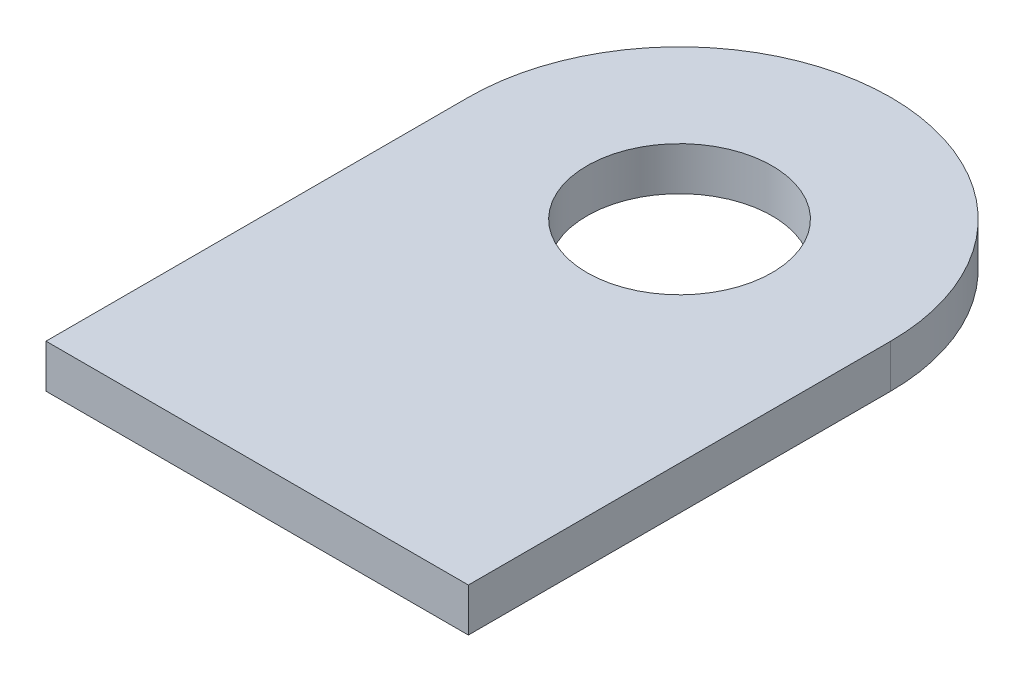
ISO-10303-21;
HEADER;
FILE_DESCRIPTION(('STEP AP214'),'2;1');
FILE_NAME('part.step','',(''),(''),'','','');
FILE_SCHEMA(('AUTOMOTIVE_DESIGN { 1 0 10303 214 1 1 1 1 }'));
ENDSEC;
DATA;
#1=APPLICATION_CONTEXT('core data for automotive mechanical design processes');
#2=APPLICATION_PROTOCOL_DEFINITION('international standard','automotive_design',2000,#1);
#3=PRODUCT_CONTEXT('',#1,'mechanical');
#4=PRODUCT('Part','Part','',(#3));
#5=PRODUCT_RELATED_PRODUCT_CATEGORY('part','',(#4));
#6=PRODUCT_DEFINITION_FORMATION('','',#4);
#7=PRODUCT_DEFINITION_CONTEXT('part definition',#1,'design');
#8=PRODUCT_DEFINITION('design','',#6,#7);
#9=PRODUCT_DEFINITION_SHAPE('','',#8);
#10=(LENGTH_UNIT() NAMED_UNIT(*) SI_UNIT(.MILLI.,.METRE.));
#11=(NAMED_UNIT(*) PLANE_ANGLE_UNIT() SI_UNIT($,.RADIAN.));
#12=(NAMED_UNIT(*) SI_UNIT($,.STERADIAN.) SOLID_ANGLE_UNIT());
#13=UNCERTAINTY_MEASURE_WITH_UNIT(LENGTH_MEASURE(1.E-05),#10,'distance_accuracy_value','');
#14=(GEOMETRIC_REPRESENTATION_CONTEXT(3) GLOBAL_UNCERTAINTY_ASSIGNED_CONTEXT((#13)) GLOBAL_UNIT_ASSIGNED_CONTEXT((#10,
#11,#12)) REPRESENTATION_CONTEXT('',''));
#15=CARTESIAN_POINT('',(0.,0.,0.));
#16=DIRECTION('',(0.,0.,1.));
#17=DIRECTION('',(1.,0.,0.));
#18=AXIS2_PLACEMENT_3D('',#15,#16,#17);
#19=CARTESIAN_POINT('',(7.5,1.54,-15.));
#20=DIRECTION('',(0.,-1.,0.));
#21=DIRECTION('',(0.,0.,-1.));
#22=AXIS2_PLACEMENT_3D('',#19,#20,#21);
#23=PLANE('',#22);
#24=DIRECTION('',(0.,0.,-1.));
#25=VECTOR('',#24,1.);
#26=CARTESIAN_POINT('',(0.,1.54,0.));
#27=LINE('',#26,#25);
#28=CARTESIAN_POINT('',(0.,1.54,0.));
#29=VERTEX_POINT('',#28);
#30=CARTESIAN_POINT('',(0.,1.54,-15.));
#31=VERTEX_POINT('',#30);
#32=EDGE_CURVE('E125',#29,#31,#27,.T.);
#33=ORIENTED_EDGE('',*,*,#32,.F.);
#34=DIRECTION('',(1.,0.,0.));
#35=VECTOR('',#34,1.);
#36=CARTESIAN_POINT('',(0.,1.54,0.));
#37=LINE('',#36,#35);
#38=CARTESIAN_POINT('',(15.,1.54,0.));
#39=VERTEX_POINT('',#38);
#40=EDGE_CURVE('E112',#29,#39,#37,.T.);
#41=ORIENTED_EDGE('',*,*,#40,.T.);
#42=DIRECTION('',(0.,0.,-1.));
#43=VECTOR('',#42,1.);
#44=CARTESIAN_POINT('',(15.,1.54,0.));
#45=LINE('',#44,#43);
#46=CARTESIAN_POINT('',(15.,1.54,-15.));
#47=VERTEX_POINT('',#46);
#48=EDGE_CURVE('E107',#39,#47,#45,.T.);
#49=ORIENTED_EDGE('',*,*,#48,.T.);
#50=CARTESIAN_POINT('',(7.5,1.54,-15.));
#51=DIRECTION('',(0.,-1.,0.));
#52=DIRECTION('',(0.,0.,-1.));
#53=AXIS2_PLACEMENT_3D('',#50,#51,#52);
#54=CIRCLE('',#53,7.5);
#55=EDGE_CURVE('E111',#31,#47,#54,.T.);
#56=ORIENTED_EDGE('',*,*,#55,.F.);
#57=EDGE_LOOP('',(#33,#41,#49,#56));
#58=FACE_BOUND('',#57,.T.);
#59=CARTESIAN_POINT('',(7.5,1.54,-15.));
#60=DIRECTION('',(0.,1.,0.));
#61=DIRECTION('',(0.,0.,1.));
#62=AXIS2_PLACEMENT_3D('',#59,#60,#61);
#63=CIRCLE('',#62,3.28803);
#64=CARTESIAN_POINT('',(7.5,1.54,-11.71197));
#65=VERTEX_POINT('',#64);
#66=EDGE_CURVE('E138',#65,#65,#63,.T.);
#67=ORIENTED_EDGE('',*,*,#66,.F.);
#68=EDGE_LOOP('',(#67));
#69=FACE_BOUND('',#68,.T.);
#70=ADVANCED_FACE('F60',(#58,#69),#23,.F.);
#71=CARTESIAN_POINT('',(7.5,0.,-15.));
#72=DIRECTION('',(0.,-1.,0.));
#73=DIRECTION('',(0.,0.,-1.));
#74=AXIS2_PLACEMENT_3D('',#71,#72,#73);
#75=PLANE('',#74);
#76=DIRECTION('',(0.,0.,-1.));
#77=VECTOR('',#76,1.);
#78=CARTESIAN_POINT('',(0.,0.,0.));
#79=LINE('',#78,#77);
#80=CARTESIAN_POINT('',(0.,0.,0.));
#81=VERTEX_POINT('',#80);
#82=CARTESIAN_POINT('',(0.,0.,-15.));
#83=VERTEX_POINT('',#82);
#84=EDGE_CURVE('E133',#81,#83,#79,.T.);
#85=ORIENTED_EDGE('',*,*,#84,.T.);
#86=CARTESIAN_POINT('',(7.5,0.,-15.));
#87=DIRECTION('',(0.,-1.,0.));
#88=DIRECTION('',(0.,0.,-1.));
#89=AXIS2_PLACEMENT_3D('',#86,#87,#88);
#90=CIRCLE('',#89,7.5);
#91=CARTESIAN_POINT('',(15.,0.,-15.));
#92=VERTEX_POINT('',#91);
#93=EDGE_CURVE('E137',#83,#92,#90,.T.);
#94=ORIENTED_EDGE('',*,*,#93,.T.);
#95=DIRECTION('',(0.,0.,-1.));
#96=VECTOR('',#95,1.);
#97=CARTESIAN_POINT('',(15.,0.,0.));
#98=LINE('',#97,#96);
#99=CARTESIAN_POINT('',(15.,0.,0.));
#100=VERTEX_POINT('',#99);
#101=EDGE_CURVE('E120',#100,#92,#98,.T.);
#102=ORIENTED_EDGE('',*,*,#101,.F.);
#103=DIRECTION('',(1.,0.,0.));
#104=VECTOR('',#103,1.);
#105=CARTESIAN_POINT('',(0.,0.,0.));
#106=LINE('',#105,#104);
#107=EDGE_CURVE('E95',#81,#100,#106,.T.);
#108=ORIENTED_EDGE('',*,*,#107,.F.);
#109=EDGE_LOOP('',(#85,#94,#102,#108));
#110=FACE_BOUND('',#109,.T.);
#111=CARTESIAN_POINT('',(7.5,0.,-15.));
#112=DIRECTION('',(0.,1.,0.));
#113=DIRECTION('',(0.,0.,1.));
#114=AXIS2_PLACEMENT_3D('',#111,#112,#113);
#115=CIRCLE('',#114,3.28803);
#116=CARTESIAN_POINT('',(7.5,0.,-11.71197));
#117=VERTEX_POINT('',#116);
#118=EDGE_CURVE('E178',#117,#117,#115,.T.);
#119=ORIENTED_EDGE('',*,*,#118,.T.);
#120=EDGE_LOOP('',(#119));
#121=FACE_BOUND('',#120,.T.);
#122=ADVANCED_FACE('F147',(#110,#121),#75,.T.);
#123=CARTESIAN_POINT('',(0.,1.54,0.));
#124=DIRECTION('',(-1.,0.,0.));
#125=DIRECTION('',(0.,0.,1.));
#126=AXIS2_PLACEMENT_3D('',#123,#124,#125);
#127=PLANE('',#126);
#128=ORIENTED_EDGE('',*,*,#84,.F.);
#129=DIRECTION('',(0.,-1.,0.));
#130=VECTOR('',#129,1.);
#131=CARTESIAN_POINT('',(0.,1.54,0.));
#132=LINE('',#131,#130);
#133=EDGE_CURVE('E12',#29,#81,#132,.T.);
#134=ORIENTED_EDGE('',*,*,#133,.F.);
#135=ORIENTED_EDGE('',*,*,#32,.T.);
#136=DIRECTION('',(0.,-1.,0.));
#137=VECTOR('',#136,1.);
#138=CARTESIAN_POINT('',(0.,1.54,-15.));
#139=LINE('',#138,#137);
#140=EDGE_CURVE('E64',#31,#83,#139,.T.);
#141=ORIENTED_EDGE('',*,*,#140,.T.);
#142=EDGE_LOOP('',(#128,#134,#135,#141));
#143=FACE_BOUND('',#142,.T.);
#144=ADVANCED_FACE('F62',(#143),#127,.T.);
#145=CARTESIAN_POINT('',(0.,1.54,0.));
#146=DIRECTION('',(0.,0.,-1.));
#147=DIRECTION('',(-1.,0.,0.));
#148=AXIS2_PLACEMENT_3D('',#145,#146,#147);
#149=PLANE('',#148);
#150=ORIENTED_EDGE('',*,*,#107,.T.);
#151=DIRECTION('',(0.,-1.,0.));
#152=VECTOR('',#151,1.);
#153=CARTESIAN_POINT('',(15.,1.54,0.));
#154=LINE('',#153,#152);
#155=EDGE_CURVE('E71',#39,#100,#154,.T.);
#156=ORIENTED_EDGE('',*,*,#155,.F.);
#157=ORIENTED_EDGE('',*,*,#40,.F.);
#158=ORIENTED_EDGE('',*,*,#133,.T.);
#159=EDGE_LOOP('',(#150,#156,#157,#158));
#160=FACE_BOUND('',#159,.T.);
#161=ADVANCED_FACE('F151',(#160),#149,.F.);
#162=CARTESIAN_POINT('',(15.,1.54,0.));
#163=DIRECTION('',(-1.,0.,0.));
#164=DIRECTION('',(0.,0.,1.));
#165=AXIS2_PLACEMENT_3D('',#162,#163,#164);
#166=PLANE('',#165);
#167=ORIENTED_EDGE('',*,*,#101,.T.);
#168=DIRECTION('',(0.,-1.,0.));
#169=VECTOR('',#168,1.);
#170=CARTESIAN_POINT('',(15.,1.54,-15.));
#171=LINE('',#170,#169);
#172=EDGE_CURVE('E117',#47,#92,#171,.T.);
#173=ORIENTED_EDGE('',*,*,#172,.F.);
#174=ORIENTED_EDGE('',*,*,#48,.F.);
#175=ORIENTED_EDGE('',*,*,#155,.T.);
#176=EDGE_LOOP('',(#167,#173,#174,#175));
#177=FACE_BOUND('',#176,.T.);
#178=ADVANCED_FACE('F118',(#177),#166,.F.);
#179=CARTESIAN_POINT('',(7.5,1.54,-15.));
#180=DIRECTION('',(0.,-1.,0.));
#181=DIRECTION('',(0.,0.,-1.));
#182=AXIS2_PLACEMENT_3D('',#179,#180,#181);
#183=CYLINDRICAL_SURFACE('',#182,7.5);
#184=ORIENTED_EDGE('',*,*,#93,.F.);
#185=ORIENTED_EDGE('',*,*,#140,.F.);
#186=ORIENTED_EDGE('',*,*,#55,.T.);
#187=ORIENTED_EDGE('',*,*,#172,.T.);
#188=EDGE_LOOP('',(#184,#185,#186,#187));
#189=FACE_BOUND('',#188,.T.);
#190=ADVANCED_FACE('F123',(#189),#183,.T.);
#191=CARTESIAN_POINT('',(7.5,1.54,-15.));
#192=DIRECTION('',(0.,-1.,0.));
#193=DIRECTION('',(0.,0.,-1.));
#194=AXIS2_PLACEMENT_3D('',#191,#192,#193);
#195=CYLINDRICAL_SURFACE('',#194,3.28803);
#196=ORIENTED_EDGE('',*,*,#66,.T.);
#197=EDGE_LOOP('',(#196));
#198=FACE_BOUND('',#197,.T.);
#199=ORIENTED_EDGE('',*,*,#118,.F.);
#200=EDGE_LOOP('',(#199));
#201=FACE_BOUND('',#200,.T.);
#202=ADVANCED_FACE('F163',(#198,#201),#195,.F.);
#203=CLOSED_SHELL('',(#70,#122,#144,#161,#178,#190,#202));
#204=MANIFOLD_SOLID_BREP('B2',#203);
#205=ADVANCED_BREP_SHAPE_REPRESENTATION('',(#18,#204),#14);
#206=SHAPE_DEFINITION_REPRESENTATION(#9,#205);
ENDSEC;
END-ISO-10303-21;
